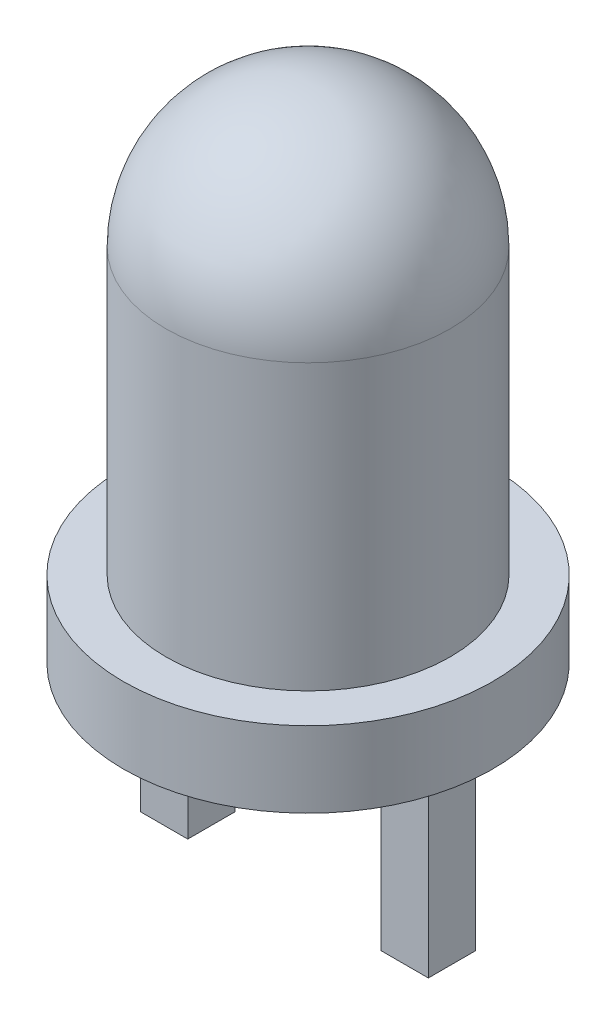
ISO-10303-21;
HEADER;
FILE_DESCRIPTION(('STEP AP214'),'2;1');
FILE_NAME('part.step','',(''),(''),'','','');
FILE_SCHEMA(('AUTOMOTIVE_DESIGN { 1 0 10303 214 1 1 1 1 }'));
ENDSEC;
DATA;
#1=APPLICATION_CONTEXT('core data for automotive mechanical design processes');
#2=APPLICATION_PROTOCOL_DEFINITION('international standard','automotive_design',2000,#1);
#3=PRODUCT_CONTEXT('',#1,'mechanical');
#4=PRODUCT('Part','Part','',(#3));
#5=PRODUCT_RELATED_PRODUCT_CATEGORY('part','',(#4));
#6=PRODUCT_DEFINITION_FORMATION('','',#4);
#7=PRODUCT_DEFINITION_CONTEXT('part definition',#1,'design');
#8=PRODUCT_DEFINITION('design','',#6,#7);
#9=PRODUCT_DEFINITION_SHAPE('','',#8);
#10=(LENGTH_UNIT() NAMED_UNIT(*) SI_UNIT(.MILLI.,.METRE.));
#11=(NAMED_UNIT(*) PLANE_ANGLE_UNIT() SI_UNIT($,.RADIAN.));
#12=(NAMED_UNIT(*) SI_UNIT($,.STERADIAN.) SOLID_ANGLE_UNIT());
#13=UNCERTAINTY_MEASURE_WITH_UNIT(LENGTH_MEASURE(1.E-05),#10,'distance_accuracy_value','');
#14=(GEOMETRIC_REPRESENTATION_CONTEXT(3) GLOBAL_UNCERTAINTY_ASSIGNED_CONTEXT((#13)) GLOBAL_UNIT_ASSIGNED_CONTEXT((#10,
#11,#12)) REPRESENTATION_CONTEXT('',''));
#15=CARTESIAN_POINT('',(0.,0.,0.));
#16=DIRECTION('',(0.,0.,1.));
#17=DIRECTION('',(1.,0.,0.));
#18=AXIS2_PLACEMENT_3D('',#15,#16,#17);
#19=CARTESIAN_POINT('',(0.,0.,0.));
#20=DIRECTION('',(0.,1.,0.));
#21=DIRECTION('',(0.,0.,1.));
#22=AXIS2_PLACEMENT_3D('',#19,#20,#21);
#23=PLANE('',#22);
#24=DIRECTION('',(0.,0.,-1.));
#25=VECTOR('',#24,1.);
#26=CARTESIAN_POINT('',(-1.52,0.,0.25));
#27=LINE('',#26,#25);
#28=CARTESIAN_POINT('',(-1.52,0.,0.25));
#29=VERTEX_POINT('',#28);
#30=CARTESIAN_POINT('',(-1.52,0.,-0.25));
#31=VERTEX_POINT('',#30);
#32=EDGE_CURVE('E119',#29,#31,#27,.T.);
#33=ORIENTED_EDGE('',*,*,#32,.F.);
#34=DIRECTION('',(-1.,0.,0.));
#35=VECTOR('',#34,1.);
#36=CARTESIAN_POINT('',(-1.52,0.,0.25));
#37=LINE('',#36,#35);
#38=CARTESIAN_POINT('',(-1.02,0.,0.25));
#39=VERTEX_POINT('',#38);
#40=EDGE_CURVE('E132',#39,#29,#37,.T.);
#41=ORIENTED_EDGE('',*,*,#40,.F.);
#42=DIRECTION('',(0.,0.,1.));
#43=VECTOR('',#42,1.);
#44=CARTESIAN_POINT('',(-1.02,0.,0.25));
#45=LINE('',#44,#43);
#46=CARTESIAN_POINT('',(-1.02,0.,-0.25));
#47=VERTEX_POINT('',#46);
#48=EDGE_CURVE('E141',#47,#39,#45,.T.);
#49=ORIENTED_EDGE('',*,*,#48,.F.);
#50=DIRECTION('',(1.,0.,0.));
#51=VECTOR('',#50,1.);
#52=CARTESIAN_POINT('',(-1.52,0.,-0.25));
#53=LINE('',#52,#51);
#54=EDGE_CURVE('E122',#31,#47,#53,.T.);
#55=ORIENTED_EDGE('',*,*,#54,.F.);
#56=EDGE_LOOP('',(#33,#41,#49,#55));
#57=FACE_BOUND('',#56,.T.);
#58=CARTESIAN_POINT('',(0.,0.,0.));
#59=DIRECTION('',(0.,1.,0.));
#60=DIRECTION('',(0.,0.,1.));
#61=AXIS2_PLACEMENT_3D('',#58,#59,#60);
#62=CIRCLE('',#61,1.95);
#63=CARTESIAN_POINT('',(0.,0.,1.95));
#64=VERTEX_POINT('',#63);
#65=EDGE_CURVE('E157',#64,#64,#62,.T.);
#66=ORIENTED_EDGE('',*,*,#65,.F.);
#67=EDGE_LOOP('',(#66));
#68=FACE_BOUND('',#67,.T.);
#69=DIRECTION('',(-1.,0.,0.));
#70=VECTOR('',#69,1.);
#71=CARTESIAN_POINT('',(1.52,0.,0.25));
#72=LINE('',#71,#70);
#73=CARTESIAN_POINT('',(1.52,0.,0.25));
#74=VERTEX_POINT('',#73);
#75=CARTESIAN_POINT('',(1.02,0.,0.25));
#76=VERTEX_POINT('',#75);
#77=EDGE_CURVE('E118',#74,#76,#72,.T.);
#78=ORIENTED_EDGE('',*,*,#77,.F.);
#79=DIRECTION('',(0.,0.,1.));
#80=VECTOR('',#79,1.);
#81=CARTESIAN_POINT('',(1.52,0.,0.25));
#82=LINE('',#81,#80);
#83=CARTESIAN_POINT('',(1.52,0.,-0.25));
#84=VERTEX_POINT('',#83);
#85=EDGE_CURVE('E115',#84,#74,#82,.T.);
#86=ORIENTED_EDGE('',*,*,#85,.F.);
#87=DIRECTION('',(1.,0.,0.));
#88=VECTOR('',#87,1.);
#89=CARTESIAN_POINT('',(1.52,0.,-0.25));
#90=LINE('',#89,#88);
#91=CARTESIAN_POINT('',(1.02,0.,-0.25));
#92=VERTEX_POINT('',#91);
#93=EDGE_CURVE('E53',#92,#84,#90,.T.);
#94=ORIENTED_EDGE('',*,*,#93,.F.);
#95=DIRECTION('',(0.,0.,-1.));
#96=VECTOR('',#95,1.);
#97=CARTESIAN_POINT('',(1.02,0.,0.25));
#98=LINE('',#97,#96);
#99=EDGE_CURVE('E48',#76,#92,#98,.T.);
#100=ORIENTED_EDGE('',*,*,#99,.F.);
#101=EDGE_LOOP('',(#78,#86,#94,#100));
#102=FACE_BOUND('',#101,.T.);
#103=ADVANCED_FACE('F33',(#57,#68,#102),#23,.F.);
#104=CARTESIAN_POINT('',(0.,3.8,0.));
#105=DIRECTION('',(0.,1.,0.));
#106=DIRECTION('',(-1.,0.,0.));
#107=AXIS2_PLACEMENT_3D('',#104,#105,#106);
#108=SPHERICAL_SURFACE('',#107,1.5);
#109=CARTESIAN_POINT('',(0.,3.8,0.));
#110=DIRECTION('',(0.,1.,0.));
#111=DIRECTION('',(0.,0.,1.));
#112=AXIS2_PLACEMENT_3D('',#109,#110,#111);
#113=CIRCLE('',#112,1.5);
#114=CARTESIAN_POINT('',(0.,3.8,1.5));
#115=VERTEX_POINT('',#114);
#116=EDGE_CURVE('E11',#115,#115,#113,.T.);
#117=ORIENTED_EDGE('',*,*,#116,.T.);
#118=EDGE_LOOP('',(#117));
#119=FACE_BOUND('',#118,.T.);
#120=ADVANCED_FACE('F35',(#119),#108,.T.);
#121=CARTESIAN_POINT('',(0.,8.78385732345139,0.));
#122=DIRECTION('',(0.,1.,0.));
#123=DIRECTION('',(0.,0.,1.));
#124=AXIS2_PLACEMENT_3D('',#121,#122,#123);
#125=CYLINDRICAL_SURFACE('',#124,1.5);
#126=CARTESIAN_POINT('',(0.,0.8,0.));
#127=DIRECTION('',(0.,1.,0.));
#128=DIRECTION('',(0.,0.,1.));
#129=AXIS2_PLACEMENT_3D('',#126,#127,#128);
#130=CIRCLE('',#129,1.5);
#131=CARTESIAN_POINT('',(0.,0.8,1.5));
#132=VERTEX_POINT('',#131);
#133=EDGE_CURVE('E41',#132,#132,#130,.T.);
#134=ORIENTED_EDGE('',*,*,#133,.T.);
#135=EDGE_LOOP('',(#134));
#136=FACE_BOUND('',#135,.T.);
#137=ORIENTED_EDGE('',*,*,#116,.F.);
#138=EDGE_LOOP('',(#137));
#139=FACE_BOUND('',#138,.T.);
#140=ADVANCED_FACE('F165',(#136,#139),#125,.T.);
#141=CARTESIAN_POINT('',(0.,0.8,0.));
#142=DIRECTION('',(0.,-1.,0.));
#143=DIRECTION('',(0.,0.,-1.));
#144=AXIS2_PLACEMENT_3D('',#141,#142,#143);
#145=PLANE('',#144);
#146=ORIENTED_EDGE('',*,*,#133,.F.);
#147=EDGE_LOOP('',(#146));
#148=FACE_BOUND('',#147,.T.);
#149=CARTESIAN_POINT('',(0.,0.8,0.));
#150=DIRECTION('',(0.,1.,0.));
#151=DIRECTION('',(0.,0.,1.));
#152=AXIS2_PLACEMENT_3D('',#149,#150,#151);
#153=CIRCLE('',#152,1.95);
#154=CARTESIAN_POINT('',(0.,0.8,1.95));
#155=VERTEX_POINT('',#154);
#156=EDGE_CURVE('E160',#155,#155,#153,.T.);
#157=ORIENTED_EDGE('',*,*,#156,.T.);
#158=EDGE_LOOP('',(#157));
#159=FACE_BOUND('',#158,.T.);
#160=ADVANCED_FACE('F168',(#148,#159),#145,.F.);
#161=CARTESIAN_POINT('',(0.,8.78385732345139,0.));
#162=DIRECTION('',(0.,1.,0.));
#163=DIRECTION('',(0.,0.,1.));
#164=AXIS2_PLACEMENT_3D('',#161,#162,#163);
#165=CYLINDRICAL_SURFACE('',#164,1.95);
#166=ORIENTED_EDGE('',*,*,#156,.F.);
#167=EDGE_LOOP('',(#166));
#168=FACE_BOUND('',#167,.T.);
#169=ORIENTED_EDGE('',*,*,#65,.T.);
#170=EDGE_LOOP('',(#169));
#171=FACE_BOUND('',#170,.T.);
#172=ADVANCED_FACE('F171',(#168,#171),#165,.T.);
#173=CARTESIAN_POINT('',(-1.52,-2.,0.25));
#174=DIRECTION('',(1.,0.,0.));
#175=DIRECTION('',(0.,0.,-1.));
#176=AXIS2_PLACEMENT_3D('',#173,#174,#175);
#177=PLANE('',#176);
#178=ORIENTED_EDGE('',*,*,#32,.T.);
#179=DIRECTION('',(0.,1.,0.));
#180=VECTOR('',#179,1.);
#181=CARTESIAN_POINT('',(-1.52,-2.,-0.25));
#182=LINE('',#181,#180);
#183=CARTESIAN_POINT('',(-1.52,-2.,-0.25));
#184=VERTEX_POINT('',#183);
#185=EDGE_CURVE('E154',#184,#31,#182,.T.);
#186=ORIENTED_EDGE('',*,*,#185,.F.);
#187=DIRECTION('',(0.,0.,-1.));
#188=VECTOR('',#187,1.);
#189=CARTESIAN_POINT('',(-1.52,-2.,0.25));
#190=LINE('',#189,#188);
#191=CARTESIAN_POINT('',(-1.52,-2.,0.25));
#192=VERTEX_POINT('',#191);
#193=EDGE_CURVE('E128',#192,#184,#190,.T.);
#194=ORIENTED_EDGE('',*,*,#193,.F.);
#195=DIRECTION('',(0.,1.,0.));
#196=VECTOR('',#195,1.);
#197=CARTESIAN_POINT('',(-1.52,-2.,0.25));
#198=LINE('',#197,#196);
#199=EDGE_CURVE('E137',#192,#29,#198,.T.);
#200=ORIENTED_EDGE('',*,*,#199,.T.);
#201=EDGE_LOOP('',(#178,#186,#194,#200));
#202=FACE_BOUND('',#201,.T.);
#203=ADVANCED_FACE('F177',(#202),#177,.F.);
#204=CARTESIAN_POINT('',(-1.52,-2.,-0.25));
#205=DIRECTION('',(0.,0.,1.));
#206=DIRECTION('',(1.,0.,0.));
#207=AXIS2_PLACEMENT_3D('',#204,#205,#206);
#208=PLANE('',#207);
#209=ORIENTED_EDGE('',*,*,#54,.T.);
#210=DIRECTION('',(0.,1.,0.));
#211=VECTOR('',#210,1.);
#212=CARTESIAN_POINT('',(-1.02,-2.,-0.25));
#213=LINE('',#212,#211);
#214=CARTESIAN_POINT('',(-1.02,-2.,-0.25));
#215=VERTEX_POINT('',#214);
#216=EDGE_CURVE('E151',#215,#47,#213,.T.);
#217=ORIENTED_EDGE('',*,*,#216,.F.);
#218=DIRECTION('',(1.,0.,0.));
#219=VECTOR('',#218,1.);
#220=CARTESIAN_POINT('',(-1.52,-2.,-0.25));
#221=LINE('',#220,#219);
#222=EDGE_CURVE('E131',#184,#215,#221,.T.);
#223=ORIENTED_EDGE('',*,*,#222,.F.);
#224=ORIENTED_EDGE('',*,*,#185,.T.);
#225=EDGE_LOOP('',(#209,#217,#223,#224));
#226=FACE_BOUND('',#225,.T.);
#227=ADVANCED_FACE('F222',(#226),#208,.F.);
#228=CARTESIAN_POINT('',(-1.02,-2.,0.25));
#229=DIRECTION('',(-1.,0.,0.));
#230=DIRECTION('',(0.,0.,1.));
#231=AXIS2_PLACEMENT_3D('',#228,#229,#230);
#232=PLANE('',#231);
#233=ORIENTED_EDGE('',*,*,#48,.T.);
#234=DIRECTION('',(0.,1.,0.));
#235=VECTOR('',#234,1.);
#236=CARTESIAN_POINT('',(-1.02,-2.,0.25));
#237=LINE('',#236,#235);
#238=CARTESIAN_POINT('',(-1.02,-2.,0.25));
#239=VERTEX_POINT('',#238);
#240=EDGE_CURVE('E148',#239,#39,#237,.T.);
#241=ORIENTED_EDGE('',*,*,#240,.F.);
#242=DIRECTION('',(0.,0.,1.));
#243=VECTOR('',#242,1.);
#244=CARTESIAN_POINT('',(-1.02,-2.,0.25));
#245=LINE('',#244,#243);
#246=EDGE_CURVE('E134',#215,#239,#245,.T.);
#247=ORIENTED_EDGE('',*,*,#246,.F.);
#248=ORIENTED_EDGE('',*,*,#216,.T.);
#249=EDGE_LOOP('',(#233,#241,#247,#248));
#250=FACE_BOUND('',#249,.T.);
#251=ADVANCED_FACE('F218',(#250),#232,.F.);
#252=CARTESIAN_POINT('',(-1.52,-2.,0.25));
#253=DIRECTION('',(0.,0.,-1.));
#254=DIRECTION('',(-1.,0.,0.));
#255=AXIS2_PLACEMENT_3D('',#252,#253,#254);
#256=PLANE('',#255);
#257=ORIENTED_EDGE('',*,*,#40,.T.);
#258=ORIENTED_EDGE('',*,*,#199,.F.);
#259=DIRECTION('',(-1.,0.,0.));
#260=VECTOR('',#259,1.);
#261=CARTESIAN_POINT('',(-1.52,-2.,0.25));
#262=LINE('',#261,#260);
#263=EDGE_CURVE('E136',#239,#192,#262,.T.);
#264=ORIENTED_EDGE('',*,*,#263,.F.);
#265=ORIENTED_EDGE('',*,*,#240,.T.);
#266=EDGE_LOOP('',(#257,#258,#264,#265));
#267=FACE_BOUND('',#266,.T.);
#268=ADVANCED_FACE('F214',(#267),#256,.F.);
#269=CARTESIAN_POINT('',(0.,-2.,0.));
#270=DIRECTION('',(0.,-1.,0.));
#271=DIRECTION('',(0.,0.,-1.));
#272=AXIS2_PLACEMENT_3D('',#269,#270,#271);
#273=PLANE('',#272);
#274=ORIENTED_EDGE('',*,*,#193,.T.);
#275=ORIENTED_EDGE('',*,*,#222,.T.);
#276=ORIENTED_EDGE('',*,*,#246,.T.);
#277=ORIENTED_EDGE('',*,*,#263,.T.);
#278=EDGE_LOOP('',(#274,#275,#276,#277));
#279=FACE_BOUND('',#278,.T.);
#280=ADVANCED_FACE('F211',(#279),#273,.T.);
#281=CARTESIAN_POINT('',(1.52,-2.,0.25));
#282=DIRECTION('',(0.,0.,-1.));
#283=DIRECTION('',(-1.,0.,0.));
#284=AXIS2_PLACEMENT_3D('',#281,#282,#283);
#285=PLANE('',#284);
#286=ORIENTED_EDGE('',*,*,#77,.T.);
#287=DIRECTION('',(0.,1.,0.));
#288=VECTOR('',#287,1.);
#289=CARTESIAN_POINT('',(1.02,-2.,0.25));
#290=LINE('',#289,#288);
#291=CARTESIAN_POINT('',(1.02,-2.,0.25));
#292=VERTEX_POINT('',#291);
#293=EDGE_CURVE('E99',#292,#76,#290,.T.);
#294=ORIENTED_EDGE('',*,*,#293,.F.);
#295=DIRECTION('',(-1.,0.,0.));
#296=VECTOR('',#295,1.);
#297=CARTESIAN_POINT('',(1.52,-2.,0.25));
#298=LINE('',#297,#296);
#299=CARTESIAN_POINT('',(1.52,-2.,0.25));
#300=VERTEX_POINT('',#299);
#301=EDGE_CURVE('E106',#300,#292,#298,.T.);
#302=ORIENTED_EDGE('',*,*,#301,.F.);
#303=DIRECTION('',(0.,1.,0.));
#304=VECTOR('',#303,1.);
#305=CARTESIAN_POINT('',(1.52,-2.,0.25));
#306=LINE('',#305,#304);
#307=EDGE_CURVE('E189',#300,#74,#306,.T.);
#308=ORIENTED_EDGE('',*,*,#307,.T.);
#309=EDGE_LOOP('',(#286,#294,#302,#308));
#310=FACE_BOUND('',#309,.T.);
#311=ADVANCED_FACE('F117',(#310),#285,.F.);
#312=CARTESIAN_POINT('',(1.02,-2.,0.25));
#313=DIRECTION('',(1.,0.,0.));
#314=DIRECTION('',(0.,0.,-1.));
#315=AXIS2_PLACEMENT_3D('',#312,#313,#314);
#316=PLANE('',#315);
#317=ORIENTED_EDGE('',*,*,#99,.T.);
#318=DIRECTION('',(0.,1.,0.));
#319=VECTOR('',#318,1.);
#320=CARTESIAN_POINT('',(1.02,-2.,-0.25));
#321=LINE('',#320,#319);
#322=CARTESIAN_POINT('',(1.02,-2.,-0.25));
#323=VERTEX_POINT('',#322);
#324=EDGE_CURVE('E102',#323,#92,#321,.T.);
#325=ORIENTED_EDGE('',*,*,#324,.F.);
#326=DIRECTION('',(0.,0.,-1.));
#327=VECTOR('',#326,1.);
#328=CARTESIAN_POINT('',(1.02,-2.,0.25));
#329=LINE('',#328,#327);
#330=EDGE_CURVE('E95',#292,#323,#329,.T.);
#331=ORIENTED_EDGE('',*,*,#330,.F.);
#332=ORIENTED_EDGE('',*,*,#293,.T.);
#333=EDGE_LOOP('',(#317,#325,#331,#332));
#334=FACE_BOUND('',#333,.T.);
#335=ADVANCED_FACE('F97',(#334),#316,.F.);
#336=CARTESIAN_POINT('',(1.52,-2.,-0.25));
#337=DIRECTION('',(0.,0.,1.));
#338=DIRECTION('',(1.,0.,0.));
#339=AXIS2_PLACEMENT_3D('',#336,#337,#338);
#340=PLANE('',#339);
#341=ORIENTED_EDGE('',*,*,#93,.T.);
#342=DIRECTION('',(0.,1.,0.));
#343=VECTOR('',#342,1.);
#344=CARTESIAN_POINT('',(1.52,-2.,-0.25));
#345=LINE('',#344,#343);
#346=CARTESIAN_POINT('',(1.52,-2.,-0.25));
#347=VERTEX_POINT('',#346);
#348=EDGE_CURVE('E124',#347,#84,#345,.T.);
#349=ORIENTED_EDGE('',*,*,#348,.F.);
#350=DIRECTION('',(1.,0.,0.));
#351=VECTOR('',#350,1.);
#352=CARTESIAN_POINT('',(1.52,-2.,-0.25));
#353=LINE('',#352,#351);
#354=EDGE_CURVE('E105',#323,#347,#353,.T.);
#355=ORIENTED_EDGE('',*,*,#354,.F.);
#356=ORIENTED_EDGE('',*,*,#324,.T.);
#357=EDGE_LOOP('',(#341,#349,#355,#356));
#358=FACE_BOUND('',#357,.T.);
#359=ADVANCED_FACE('F198',(#358),#340,.F.);
#360=CARTESIAN_POINT('',(1.52,-2.,0.25));
#361=DIRECTION('',(-1.,0.,0.));
#362=DIRECTION('',(0.,0.,1.));
#363=AXIS2_PLACEMENT_3D('',#360,#361,#362);
#364=PLANE('',#363);
#365=ORIENTED_EDGE('',*,*,#85,.T.);
#366=ORIENTED_EDGE('',*,*,#307,.F.);
#367=DIRECTION('',(0.,0.,1.));
#368=VECTOR('',#367,1.);
#369=CARTESIAN_POINT('',(1.52,-2.,0.25));
#370=LINE('',#369,#368);
#371=EDGE_CURVE('E111',#347,#300,#370,.T.);
#372=ORIENTED_EDGE('',*,*,#371,.F.);
#373=ORIENTED_EDGE('',*,*,#348,.T.);
#374=EDGE_LOOP('',(#365,#366,#372,#373));
#375=FACE_BOUND('',#374,.T.);
#376=ADVANCED_FACE('F188',(#375),#364,.F.);
#377=CARTESIAN_POINT('',(0.,-2.,0.));
#378=DIRECTION('',(0.,-1.,0.));
#379=DIRECTION('',(0.,0.,-1.));
#380=AXIS2_PLACEMENT_3D('',#377,#378,#379);
#381=PLANE('',#380);
#382=ORIENTED_EDGE('',*,*,#301,.T.);
#383=ORIENTED_EDGE('',*,*,#330,.T.);
#384=ORIENTED_EDGE('',*,*,#354,.T.);
#385=ORIENTED_EDGE('',*,*,#371,.T.);
#386=EDGE_LOOP('',(#382,#383,#384,#385));
#387=FACE_BOUND('',#386,.T.);
#388=ADVANCED_FACE('F109',(#387),#381,.T.);
#389=CLOSED_SHELL('',(#103,#120,#140,#160,#172,#203,#227,#251,#268,#280,#311,#335,#359,#376,#388));
#390=MANIFOLD_SOLID_BREP('B2',#389);
#391=ADVANCED_BREP_SHAPE_REPRESENTATION('',(#18,#390),#14);
#392=SHAPE_DEFINITION_REPRESENTATION(#9,#391);
ENDSEC;
END-ISO-10303-21;
